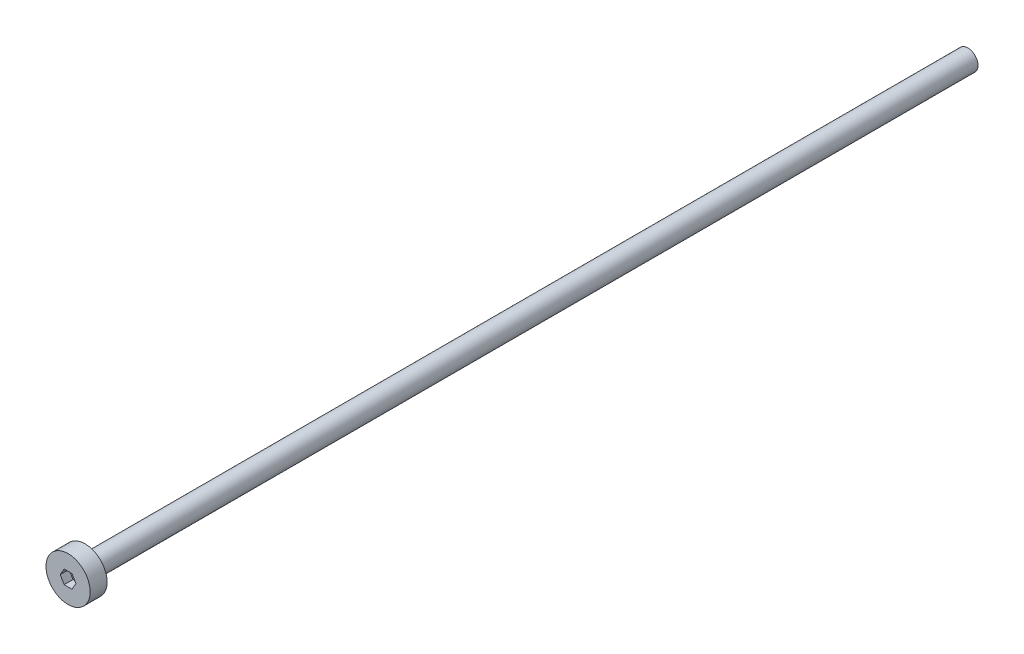
ISO-10303-21;
HEADER;
FILE_DESCRIPTION(('STEP AP214'),'2;1');
FILE_NAME('part.step','',(''),(''),'','','');
FILE_SCHEMA(('AUTOMOTIVE_DESIGN { 1 0 10303 214 1 1 1 1 }'));
ENDSEC;
DATA;
#1=APPLICATION_CONTEXT('core data for automotive mechanical design processes');
#2=APPLICATION_PROTOCOL_DEFINITION('international standard','automotive_design',2000,#1);
#3=PRODUCT_CONTEXT('',#1,'mechanical');
#4=PRODUCT('Part','Part','',(#3));
#5=PRODUCT_RELATED_PRODUCT_CATEGORY('part','',(#4));
#6=PRODUCT_DEFINITION_FORMATION('','',#4);
#7=PRODUCT_DEFINITION_CONTEXT('part definition',#1,'design');
#8=PRODUCT_DEFINITION('design','',#6,#7);
#9=PRODUCT_DEFINITION_SHAPE('','',#8);
#10=(LENGTH_UNIT() NAMED_UNIT(*) SI_UNIT(.MILLI.,.METRE.));
#11=(NAMED_UNIT(*) PLANE_ANGLE_UNIT() SI_UNIT($,.RADIAN.));
#12=(NAMED_UNIT(*) SI_UNIT($,.STERADIAN.) SOLID_ANGLE_UNIT());
#13=UNCERTAINTY_MEASURE_WITH_UNIT(LENGTH_MEASURE(1.E-05),#10,'distance_accuracy_value','');
#14=(GEOMETRIC_REPRESENTATION_CONTEXT(3) GLOBAL_UNCERTAINTY_ASSIGNED_CONTEXT((#13)) GLOBAL_UNIT_ASSIGNED_CONTEXT((#10,
#11,#12)) REPRESENTATION_CONTEXT('',''));
#15=CARTESIAN_POINT('',(0.,0.,0.));
#16=DIRECTION('',(0.,0.,1.));
#17=DIRECTION('',(1.,0.,0.));
#18=AXIS2_PLACEMENT_3D('',#15,#16,#17);
#19=CARTESIAN_POINT('',(0.,0.,1.2));
#20=DIRECTION('',(0.,0.,1.));
#21=DIRECTION('',(1.,0.,0.));
#22=AXIS2_PLACEMENT_3D('',#19,#20,#21);
#23=PLANE('',#22);
#24=DIRECTION('',(-0.50000000000019,0.866025403784329,0.));
#25=VECTOR('',#24,1.);
#26=CARTESIAN_POINT('',(1.154700538379,0.,1.2));
#27=LINE('',#26,#25);
#28=CARTESIAN_POINT('',(1.154700538379,0.,1.2));
#29=VERTEX_POINT('',#28);
#30=CARTESIAN_POINT('',(0.57735026919,1.,1.2));
#31=VERTEX_POINT('',#30);
#32=EDGE_CURVE('E9',#29,#31,#27,.T.);
#33=ORIENTED_EDGE('',*,*,#32,.T.);
#34=DIRECTION('',(-1.,0.,0.));
#35=VECTOR('',#34,1.);
#36=CARTESIAN_POINT('',(0.57735026919,1.,1.2));
#37=LINE('',#36,#35);
#38=CARTESIAN_POINT('',(-0.57735026919,1.,1.2));
#39=VERTEX_POINT('',#38);
#40=EDGE_CURVE('E149',#31,#39,#37,.T.);
#41=ORIENTED_EDGE('',*,*,#40,.T.);
#42=DIRECTION('',(-0.50000000000019,-0.866025403784329,0.));
#43=VECTOR('',#42,1.);
#44=CARTESIAN_POINT('',(-0.57735026919,1.,1.2));
#45=LINE('',#44,#43);
#46=CARTESIAN_POINT('',(-1.154700538379,0.,1.2));
#47=VERTEX_POINT('',#46);
#48=EDGE_CURVE('E106',#39,#47,#45,.T.);
#49=ORIENTED_EDGE('',*,*,#48,.T.);
#50=DIRECTION('',(0.50000000000019,-0.866025403784329,0.));
#51=VECTOR('',#50,1.);
#52=CARTESIAN_POINT('',(-1.154700538379,0.,1.2));
#53=LINE('',#52,#51);
#54=CARTESIAN_POINT('',(-0.57735026919,-1.,1.2));
#55=VERTEX_POINT('',#54);
#56=EDGE_CURVE('E109',#47,#55,#53,.T.);
#57=ORIENTED_EDGE('',*,*,#56,.T.);
#58=DIRECTION('',(1.,0.,0.));
#59=VECTOR('',#58,1.);
#60=CARTESIAN_POINT('',(-0.57735026919,-1.,1.2));
#61=LINE('',#60,#59);
#62=CARTESIAN_POINT('',(0.57735026919,-1.,1.2));
#63=VERTEX_POINT('',#62);
#64=EDGE_CURVE('E112',#55,#63,#61,.T.);
#65=ORIENTED_EDGE('',*,*,#64,.T.);
#66=DIRECTION('',(0.50000000000019,0.866025403784329,0.));
#67=VECTOR('',#66,1.);
#68=CARTESIAN_POINT('',(0.57735026919,-1.,1.2));
#69=LINE('',#68,#67);
#70=EDGE_CURVE('E144',#63,#29,#69,.T.);
#71=ORIENTED_EDGE('',*,*,#70,.T.);
#72=EDGE_LOOP('',(#33,#41,#49,#57,#65,#71));
#73=FACE_BOUND('',#72,.T.);
#74=ADVANCED_FACE('F14',(#73),#23,.T.);
#75=CARTESIAN_POINT('',(0.,0.,-130.));
#76=DIRECTION('',(0.,0.,-1.));
#77=DIRECTION('',(0.,-1.,0.));
#78=AXIS2_PLACEMENT_3D('',#75,#76,#77);
#79=PLANE('',#78);
#80=CARTESIAN_POINT('',(0.,0.,-130.));
#81=DIRECTION('',(0.,0.,-1.));
#82=DIRECTION('',(-1.,0.,0.));
#83=AXIS2_PLACEMENT_3D('',#80,#81,#82);
#84=CIRCLE('',#83,1.5);
#85=CARTESIAN_POINT('',(-1.5,0.,-130.));
#86=VERTEX_POINT('',#85);
#87=EDGE_CURVE('E154',#86,#86,#84,.T.);
#88=ORIENTED_EDGE('',*,*,#87,.T.);
#89=EDGE_LOOP('',(#88));
#90=FACE_BOUND('',#89,.T.);
#91=ADVANCED_FACE('F212',(#90),#79,.T.);
#92=CARTESIAN_POINT('',(1.154700538379,0.,1.2));
#93=DIRECTION('',(-0.866025403784329,-0.50000000000019,0.));
#94=DIRECTION('',(-0.50000000000019,0.866025403784329,0.));
#95=AXIS2_PLACEMENT_3D('',#92,#93,#94);
#96=PLANE('',#95);
#97=ORIENTED_EDGE('',*,*,#32,.F.);
#98=DIRECTION('',(0.,0.,1.));
#99=VECTOR('',#98,1.);
#100=CARTESIAN_POINT('',(1.154700538379,0.,1.2));
#101=LINE('',#100,#99);
#102=CARTESIAN_POINT('',(1.154700538379,0.,2.5));
#103=VERTEX_POINT('',#102);
#104=EDGE_CURVE('E128',#29,#103,#101,.T.);
#105=ORIENTED_EDGE('',*,*,#104,.T.);
#106=DIRECTION('',(-0.50000000000019,0.866025403784329,0.));
#107=VECTOR('',#106,1.);
#108=CARTESIAN_POINT('',(1.010362971082,0.25,2.5));
#109=LINE('',#108,#107);
#110=CARTESIAN_POINT('',(0.57735026919,1.,2.5));
#111=VERTEX_POINT('',#110);
#112=EDGE_CURVE('E161',#103,#111,#109,.T.);
#113=ORIENTED_EDGE('',*,*,#112,.T.);
#114=DIRECTION('',(0.,0.,1.));
#115=VECTOR('',#114,1.);
#116=CARTESIAN_POINT('',(0.57735026919,1.,1.2));
#117=LINE('',#116,#115);
#118=EDGE_CURVE('E25',#31,#111,#117,.T.);
#119=ORIENTED_EDGE('',*,*,#118,.F.);
#120=EDGE_LOOP('',(#97,#105,#113,#119));
#121=FACE_BOUND('',#120,.T.);
#122=ADVANCED_FACE('F195',(#121),#96,.T.);
#123=CARTESIAN_POINT('',(0.57735026919,1.,1.2));
#124=DIRECTION('',(0.,-1.,0.));
#125=DIRECTION('',(-1.,0.,0.));
#126=AXIS2_PLACEMENT_3D('',#123,#124,#125);
#127=PLANE('',#126);
#128=ORIENTED_EDGE('',*,*,#40,.F.);
#129=ORIENTED_EDGE('',*,*,#118,.T.);
#130=DIRECTION('',(-1.,0.,0.));
#131=VECTOR('',#130,1.);
#132=CARTESIAN_POINT('',(0.288675134595,1.,2.5));
#133=LINE('',#132,#131);
#134=CARTESIAN_POINT('',(-0.57735026919,1.,2.5));
#135=VERTEX_POINT('',#134);
#136=EDGE_CURVE('E140',#111,#135,#133,.T.);
#137=ORIENTED_EDGE('',*,*,#136,.T.);
#138=DIRECTION('',(0.,0.,1.));
#139=VECTOR('',#138,1.);
#140=CARTESIAN_POINT('',(-0.57735026919,1.,1.2));
#141=LINE('',#140,#139);
#142=EDGE_CURVE('E89',#39,#135,#141,.T.);
#143=ORIENTED_EDGE('',*,*,#142,.F.);
#144=EDGE_LOOP('',(#128,#129,#137,#143));
#145=FACE_BOUND('',#144,.T.);
#146=ADVANCED_FACE('F198',(#145),#127,.T.);
#147=CARTESIAN_POINT('',(-0.57735026919,1.,1.2));
#148=DIRECTION('',(0.866025403784329,-0.50000000000019,0.));
#149=DIRECTION('',(0.,0.,-1.));
#150=AXIS2_PLACEMENT_3D('',#147,#148,#149);
#151=PLANE('',#150);
#152=ORIENTED_EDGE('',*,*,#48,.F.);
#153=ORIENTED_EDGE('',*,*,#142,.T.);
#154=DIRECTION('',(-0.50000000000019,-0.866025403784329,0.));
#155=VECTOR('',#154,1.);
#156=CARTESIAN_POINT('',(-0.721687836487,0.75,2.5));
#157=LINE('',#156,#155);
#158=CARTESIAN_POINT('',(-1.154700538379,0.,2.5));
#159=VERTEX_POINT('',#158);
#160=EDGE_CURVE('E139',#135,#159,#157,.T.);
#161=ORIENTED_EDGE('',*,*,#160,.T.);
#162=DIRECTION('',(0.,0.,1.));
#163=VECTOR('',#162,1.);
#164=CARTESIAN_POINT('',(-1.154700538379,0.,1.2));
#165=LINE('',#164,#163);
#166=EDGE_CURVE('E78',#47,#159,#165,.T.);
#167=ORIENTED_EDGE('',*,*,#166,.F.);
#168=EDGE_LOOP('',(#152,#153,#161,#167));
#169=FACE_BOUND('',#168,.T.);
#170=ADVANCED_FACE('F238',(#169),#151,.T.);
#171=CARTESIAN_POINT('',(-1.154700538379,0.,1.2));
#172=DIRECTION('',(0.866025403784329,0.50000000000019,0.));
#173=DIRECTION('',(0.,0.,-1.));
#174=AXIS2_PLACEMENT_3D('',#171,#172,#173);
#175=PLANE('',#174);
#176=ORIENTED_EDGE('',*,*,#56,.F.);
#177=ORIENTED_EDGE('',*,*,#166,.T.);
#178=DIRECTION('',(0.50000000000019,-0.866025403784329,0.));
#179=VECTOR('',#178,1.);
#180=CARTESIAN_POINT('',(-1.010362971082,-0.25,2.5));
#181=LINE('',#180,#179);
#182=CARTESIAN_POINT('',(-0.57735026919,-1.,2.5));
#183=VERTEX_POINT('',#182);
#184=EDGE_CURVE('E119',#159,#183,#181,.T.);
#185=ORIENTED_EDGE('',*,*,#184,.T.);
#186=DIRECTION('',(0.,0.,1.));
#187=VECTOR('',#186,1.);
#188=CARTESIAN_POINT('',(-0.57735026919,-1.,1.2));
#189=LINE('',#188,#187);
#190=EDGE_CURVE('E115',#55,#183,#189,.T.);
#191=ORIENTED_EDGE('',*,*,#190,.F.);
#192=EDGE_LOOP('',(#176,#177,#185,#191));
#193=FACE_BOUND('',#192,.T.);
#194=ADVANCED_FACE('F117',(#193),#175,.T.);
#195=CARTESIAN_POINT('',(-0.57735026919,-1.,1.2));
#196=DIRECTION('',(0.,1.,0.));
#197=DIRECTION('',(1.,0.,0.));
#198=AXIS2_PLACEMENT_3D('',#195,#196,#197);
#199=PLANE('',#198);
#200=ORIENTED_EDGE('',*,*,#64,.F.);
#201=ORIENTED_EDGE('',*,*,#190,.T.);
#202=DIRECTION('',(1.,0.,0.));
#203=VECTOR('',#202,1.);
#204=CARTESIAN_POINT('',(-0.288675134595,-1.,2.5));
#205=LINE('',#204,#203);
#206=CARTESIAN_POINT('',(0.57735026919,-1.,2.5));
#207=VERTEX_POINT('',#206);
#208=EDGE_CURVE('E169',#183,#207,#205,.T.);
#209=ORIENTED_EDGE('',*,*,#208,.T.);
#210=DIRECTION('',(0.,0.,1.));
#211=VECTOR('',#210,1.);
#212=CARTESIAN_POINT('',(0.57735026919,-1.,1.2));
#213=LINE('',#212,#211);
#214=EDGE_CURVE('E125',#63,#207,#213,.T.);
#215=ORIENTED_EDGE('',*,*,#214,.F.);
#216=EDGE_LOOP('',(#200,#201,#209,#215));
#217=FACE_BOUND('',#216,.T.);
#218=ADVANCED_FACE('F16',(#217),#199,.T.);
#219=CARTESIAN_POINT('',(0.57735026919,-1.,1.2));
#220=DIRECTION('',(-0.866025403784329,0.50000000000019,0.));
#221=DIRECTION('',(0.,0.,1.));
#222=AXIS2_PLACEMENT_3D('',#219,#220,#221);
#223=PLANE('',#222);
#224=ORIENTED_EDGE('',*,*,#70,.F.);
#225=ORIENTED_EDGE('',*,*,#214,.T.);
#226=DIRECTION('',(0.50000000000019,0.866025403784329,0.));
#227=VECTOR('',#226,1.);
#228=CARTESIAN_POINT('',(0.721687836487,-0.75,2.5));
#229=LINE('',#228,#227);
#230=EDGE_CURVE('E158',#207,#103,#229,.T.);
#231=ORIENTED_EDGE('',*,*,#230,.T.);
#232=ORIENTED_EDGE('',*,*,#104,.F.);
#233=EDGE_LOOP('',(#224,#225,#231,#232));
#234=FACE_BOUND('',#233,.T.);
#235=ADVANCED_FACE('F188',(#234),#223,.T.);
#236=CARTESIAN_POINT('',(0.,0.,0.));
#237=DIRECTION('',(0.,0.,-1.));
#238=DIRECTION('',(-1.,0.,0.));
#239=AXIS2_PLACEMENT_3D('',#236,#237,#238);
#240=CYLINDRICAL_SURFACE('',#239,1.5);
#241=ORIENTED_EDGE('',*,*,#87,.F.);
#242=DIRECTION('',(0.,0.,-1.));
#243=VECTOR('',#242,1.);
#244=CARTESIAN_POINT('',(-1.5,0.,0.));
#245=LINE('',#244,#243);
#246=CARTESIAN_POINT('',(-1.5,0.,0.));
#247=VERTEX_POINT('',#246);
#248=EDGE_CURVE('E137',#247,#86,#245,.T.);
#249=ORIENTED_EDGE('',*,*,#248,.F.);
#250=CARTESIAN_POINT('',(0.,0.,0.));
#251=DIRECTION('',(0.,0.,-1.));
#252=DIRECTION('',(-1.,0.,0.));
#253=AXIS2_PLACEMENT_3D('',#250,#251,#252);
#254=CIRCLE('',#253,1.5);
#255=EDGE_CURVE('E165',#247,#247,#254,.T.);
#256=ORIENTED_EDGE('',*,*,#255,.T.);
#257=ORIENTED_EDGE('',*,*,#248,.T.);
#258=EDGE_LOOP('',(#241,#249,#256,#257));
#259=FACE_BOUND('',#258,.T.);
#260=ADVANCED_FACE('F209',(#259),#240,.T.);
#261=CARTESIAN_POINT('',(0.,0.,2.5));
#262=DIRECTION('',(0.,0.,-1.));
#263=DIRECTION('',(0.,-1.,0.));
#264=AXIS2_PLACEMENT_3D('',#261,#262,#263);
#265=PLANE('',#264);
#266=ORIENTED_EDGE('',*,*,#208,.F.);
#267=ORIENTED_EDGE('',*,*,#184,.F.);
#268=ORIENTED_EDGE('',*,*,#160,.F.);
#269=ORIENTED_EDGE('',*,*,#136,.F.);
#270=ORIENTED_EDGE('',*,*,#112,.F.);
#271=ORIENTED_EDGE('',*,*,#230,.F.);
#272=EDGE_LOOP('',(#266,#267,#268,#269,#270,#271));
#273=FACE_BOUND('',#272,.T.);
#274=CARTESIAN_POINT('',(0.,0.,2.5));
#275=DIRECTION('',(0.,0.,-1.));
#276=DIRECTION('',(-1.,0.,0.));
#277=AXIS2_PLACEMENT_3D('',#274,#275,#276);
#278=CIRCLE('',#277,3.25);
#279=CARTESIAN_POINT('',(-3.25,0.,2.5));
#280=VERTEX_POINT('',#279);
#281=EDGE_CURVE('E170',#280,#280,#278,.T.);
#282=ORIENTED_EDGE('',*,*,#281,.F.);
#283=EDGE_LOOP('',(#282));
#284=FACE_BOUND('',#283,.T.);
#285=ADVANCED_FACE('F191',(#273,#284),#265,.F.);
#286=CARTESIAN_POINT('',(0.,0.,0.));
#287=DIRECTION('',(0.,0.,-1.));
#288=DIRECTION('',(0.,-1.,0.));
#289=AXIS2_PLACEMENT_3D('',#286,#287,#288);
#290=PLANE('',#289);
#291=ORIENTED_EDGE('',*,*,#255,.F.);
#292=EDGE_LOOP('',(#291));
#293=FACE_BOUND('',#292,.T.);
#294=CARTESIAN_POINT('',(0.,0.,0.));
#295=DIRECTION('',(0.,0.,-1.));
#296=DIRECTION('',(-1.,0.,0.));
#297=AXIS2_PLACEMENT_3D('',#294,#295,#296);
#298=CIRCLE('',#297,3.25);
#299=CARTESIAN_POINT('',(-3.25,0.,0.));
#300=VERTEX_POINT('',#299);
#301=EDGE_CURVE('E150',#300,#300,#298,.T.);
#302=ORIENTED_EDGE('',*,*,#301,.T.);
#303=EDGE_LOOP('',(#302));
#304=FACE_BOUND('',#303,.T.);
#305=ADVANCED_FACE('F225',(#293,#304),#290,.T.);
#306=CARTESIAN_POINT('',(0.,0.,2.5));
#307=DIRECTION('',(0.,0.,-1.));
#308=DIRECTION('',(-1.,0.,0.));
#309=AXIS2_PLACEMENT_3D('',#306,#307,#308);
#310=CYLINDRICAL_SURFACE('',#309,3.25);
#311=ORIENTED_EDGE('',*,*,#301,.F.);
#312=DIRECTION('',(0.,0.,-1.));
#313=VECTOR('',#312,1.);
#314=CARTESIAN_POINT('',(-3.25,0.,2.5));
#315=LINE('',#314,#313);
#316=EDGE_CURVE('E18',#280,#300,#315,.T.);
#317=ORIENTED_EDGE('',*,*,#316,.F.);
#318=ORIENTED_EDGE('',*,*,#281,.T.);
#319=ORIENTED_EDGE('',*,*,#316,.T.);
#320=EDGE_LOOP('',(#311,#317,#318,#319));
#321=FACE_BOUND('',#320,.T.);
#322=ADVANCED_FACE('F227',(#321),#310,.T.);
#323=CLOSED_SHELL('',(#74,#91,#122,#146,#170,#194,#218,#235,#260,#285,#305,#322));
#324=MANIFOLD_SOLID_BREP('B1',#323);
#325=ADVANCED_BREP_SHAPE_REPRESENTATION('',(#18,#324),#14);
#326=SHAPE_DEFINITION_REPRESENTATION(#9,#325);
ENDSEC;
END-ISO-10303-21;
